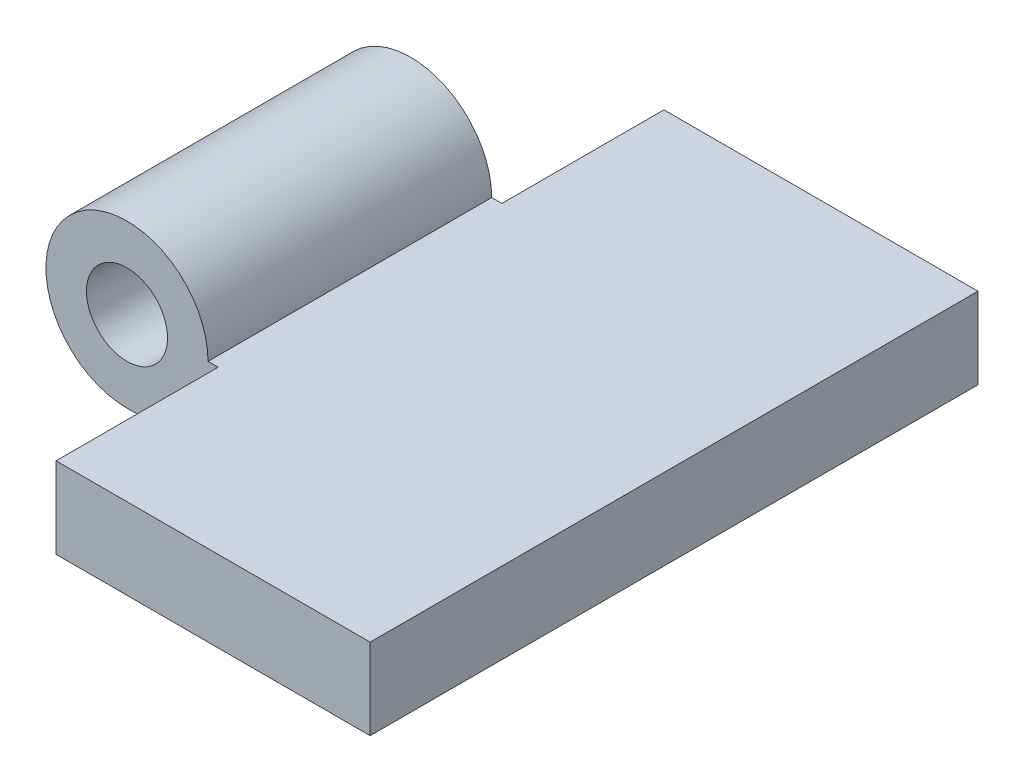
ISO-10303-21;
HEADER;
FILE_DESCRIPTION(('STEP AP214'),'2;1');
FILE_NAME('part.step','',(''),(''),'','','');
FILE_SCHEMA(('AUTOMOTIVE_DESIGN { 1 0 10303 214 1 1 1 1 }'));
ENDSEC;
DATA;
#1=APPLICATION_CONTEXT('core data for automotive mechanical design processes');
#2=APPLICATION_PROTOCOL_DEFINITION('international standard','automotive_design',2000,#1);
#3=PRODUCT_CONTEXT('',#1,'mechanical');
#4=PRODUCT('Part','Part','',(#3));
#5=PRODUCT_RELATED_PRODUCT_CATEGORY('part','',(#4));
#6=PRODUCT_DEFINITION_FORMATION('','',#4);
#7=PRODUCT_DEFINITION_CONTEXT('part definition',#1,'design');
#8=PRODUCT_DEFINITION('design','',#6,#7);
#9=PRODUCT_DEFINITION_SHAPE('','',#8);
#10=(LENGTH_UNIT() NAMED_UNIT(*) SI_UNIT(.MILLI.,.METRE.));
#11=(NAMED_UNIT(*) PLANE_ANGLE_UNIT() SI_UNIT($,.RADIAN.));
#12=(NAMED_UNIT(*) SI_UNIT($,.STERADIAN.) SOLID_ANGLE_UNIT());
#13=UNCERTAINTY_MEASURE_WITH_UNIT(LENGTH_MEASURE(1.E-05),#10,'distance_accuracy_value','');
#14=(GEOMETRIC_REPRESENTATION_CONTEXT(3) GLOBAL_UNCERTAINTY_ASSIGNED_CONTEXT((#13)) GLOBAL_UNIT_ASSIGNED_CONTEXT((#10,
#11,#12)) REPRESENTATION_CONTEXT('',''));
#15=CARTESIAN_POINT('',(0.,0.,0.));
#16=DIRECTION('',(0.,0.,1.));
#17=DIRECTION('',(1.,0.,0.));
#18=AXIS2_PLACEMENT_3D('',#15,#16,#17);
#19=CARTESIAN_POINT('',(20.,0.,30.));
#20=DIRECTION('',(-1.,0.,0.));
#21=DIRECTION('',(0.,0.,1.));
#22=AXIS2_PLACEMENT_3D('',#19,#20,#21);
#23=PLANE('',#22);
#24=DIRECTION('',(0.,1.,0.));
#25=VECTOR('',#24,1.);
#26=CARTESIAN_POINT('',(20.,0.,0.));
#27=LINE('',#26,#25);
#28=CARTESIAN_POINT('',(20.,-4.,0.));
#29=VERTEX_POINT('',#28);
#30=CARTESIAN_POINT('',(20.,0.,0.));
#31=VERTEX_POINT('',#30);
#32=EDGE_CURVE('E164',#29,#31,#27,.T.);
#33=ORIENTED_EDGE('',*,*,#32,.T.);
#34=DIRECTION('',(0.,0.,-1.));
#35=VECTOR('',#34,1.);
#36=CARTESIAN_POINT('',(20.,0.,30.));
#37=LINE('',#36,#35);
#38=CARTESIAN_POINT('',(20.,0.,30.));
#39=VERTEX_POINT('',#38);
#40=EDGE_CURVE('E196',#39,#31,#37,.T.);
#41=ORIENTED_EDGE('',*,*,#40,.F.);
#42=DIRECTION('',(0.,1.,0.));
#43=VECTOR('',#42,1.);
#44=CARTESIAN_POINT('',(20.,0.,30.));
#45=LINE('',#44,#43);
#46=CARTESIAN_POINT('',(20.,-4.,30.));
#47=VERTEX_POINT('',#46);
#48=EDGE_CURVE('E165',#47,#39,#45,.T.);
#49=ORIENTED_EDGE('',*,*,#48,.F.);
#50=DIRECTION('',(0.,0.,-1.));
#51=VECTOR('',#50,1.);
#52=CARTESIAN_POINT('',(20.,-4.,30.));
#53=LINE('',#52,#51);
#54=EDGE_CURVE('E176',#47,#29,#53,.T.);
#55=ORIENTED_EDGE('',*,*,#54,.T.);
#56=EDGE_LOOP('',(#33,#41,#49,#55));
#57=FACE_BOUND('',#56,.T.);
#58=ADVANCED_FACE('F45',(#57),#23,.F.);
#59=CARTESIAN_POINT('',(4.,0.,30.));
#60=DIRECTION('',(0.,-1.,0.));
#61=DIRECTION('',(0.,0.,-1.));
#62=AXIS2_PLACEMENT_3D('',#59,#60,#61);
#63=PLANE('',#62);
#64=DIRECTION('',(1.,0.,0.));
#65=VECTOR('',#64,1.);
#66=CARTESIAN_POINT('',(4.,0.,22.));
#67=LINE('',#66,#65);
#68=CARTESIAN_POINT('',(4.,0.,22.));
#69=VERTEX_POINT('',#68);
#70=CARTESIAN_POINT('',(4.5,0.,22.));
#71=VERTEX_POINT('',#70);
#72=EDGE_CURVE('E161',#69,#71,#67,.T.);
#73=ORIENTED_EDGE('',*,*,#72,.T.);
#74=DIRECTION('',(0.,0.,1.));
#75=VECTOR('',#74,1.);
#76=CARTESIAN_POINT('',(4.5,0.,30.));
#77=LINE('',#76,#75);
#78=CARTESIAN_POINT('',(4.5,0.,30.));
#79=VERTEX_POINT('',#78);
#80=EDGE_CURVE('E113',#71,#79,#77,.T.);
#81=ORIENTED_EDGE('',*,*,#80,.T.);
#82=DIRECTION('',(-1.,0.,0.));
#83=VECTOR('',#82,1.);
#84=CARTESIAN_POINT('',(4.,0.,30.));
#85=LINE('',#84,#83);
#86=EDGE_CURVE('E169',#39,#79,#85,.T.);
#87=ORIENTED_EDGE('',*,*,#86,.F.);
#88=ORIENTED_EDGE('',*,*,#40,.T.);
#89=DIRECTION('',(-1.,0.,0.));
#90=VECTOR('',#89,1.);
#91=CARTESIAN_POINT('',(4.,0.,0.));
#92=LINE('',#91,#90);
#93=CARTESIAN_POINT('',(4.5,0.,0.));
#94=VERTEX_POINT('',#93);
#95=EDGE_CURVE('E180',#31,#94,#92,.T.);
#96=ORIENTED_EDGE('',*,*,#95,.T.);
#97=DIRECTION('',(0.,0.,1.));
#98=VECTOR('',#97,1.);
#99=CARTESIAN_POINT('',(4.5,0.,30.));
#100=LINE('',#99,#98);
#101=CARTESIAN_POINT('',(4.5,0.,8.));
#102=VERTEX_POINT('',#101);
#103=EDGE_CURVE('E68',#94,#102,#100,.T.);
#104=ORIENTED_EDGE('',*,*,#103,.T.);
#105=DIRECTION('',(-1.,0.,0.));
#106=VECTOR('',#105,1.);
#107=CARTESIAN_POINT('',(4.,0.,8.));
#108=LINE('',#107,#106);
#109=CARTESIAN_POINT('',(4.,0.,8.));
#110=VERTEX_POINT('',#109);
#111=EDGE_CURVE('E155',#102,#110,#108,.T.);
#112=ORIENTED_EDGE('',*,*,#111,.T.);
#113=DIRECTION('',(0.,0.,-1.));
#114=VECTOR('',#113,1.);
#115=CARTESIAN_POINT('',(4.,0.,30.));
#116=LINE('',#115,#114);
#117=EDGE_CURVE('E192',#69,#110,#116,.T.);
#118=ORIENTED_EDGE('',*,*,#117,.F.);
#119=EDGE_LOOP('',(#73,#81,#87,#88,#96,#104,#112,#118));
#120=FACE_BOUND('',#119,.T.);
#121=ADVANCED_FACE('F207',(#120),#63,.F.);
#122=CARTESIAN_POINT('',(0.,0.,30.));
#123=DIRECTION('',(0.,0.,-1.));
#124=DIRECTION('',(-1.,0.,0.));
#125=AXIS2_PLACEMENT_3D('',#122,#123,#124);
#126=CYLINDRICAL_SURFACE('',#125,4.);
#127=DIRECTION('',(0.,0.,-1.));
#128=VECTOR('',#127,1.);
#129=CARTESIAN_POINT('',(0.,-4.,30.));
#130=LINE('',#129,#128);
#131=CARTESIAN_POINT('',(0.,-4.,22.));
#132=VERTEX_POINT('',#131);
#133=CARTESIAN_POINT('',(0.,-4.,8.));
#134=VERTEX_POINT('',#133);
#135=EDGE_CURVE('E189',#132,#134,#130,.T.);
#136=ORIENTED_EDGE('',*,*,#135,.F.);
#137=CARTESIAN_POINT('',(0.,0.,22.));
#138=DIRECTION('',(0.,0.,-1.));
#139=DIRECTION('',(-1.,0.,0.));
#140=AXIS2_PLACEMENT_3D('',#137,#138,#139);
#141=CIRCLE('',#140,4.);
#142=EDGE_CURVE('E122',#132,#69,#141,.T.);
#143=ORIENTED_EDGE('',*,*,#142,.T.);
#144=ORIENTED_EDGE('',*,*,#117,.T.);
#145=CARTESIAN_POINT('',(0.,0.,8.));
#146=DIRECTION('',(0.,0.,1.));
#147=DIRECTION('',(1.,0.,0.));
#148=AXIS2_PLACEMENT_3D('',#145,#146,#147);
#149=CIRCLE('',#148,4.);
#150=EDGE_CURVE('E151',#110,#134,#149,.T.);
#151=ORIENTED_EDGE('',*,*,#150,.T.);
#152=EDGE_LOOP('',(#136,#143,#144,#151));
#153=FACE_BOUND('',#152,.T.);
#154=ADVANCED_FACE('F217',(#153),#126,.T.);
#155=CARTESIAN_POINT('',(0.,-4.,30.));
#156=DIRECTION('',(0.,1.,0.));
#157=DIRECTION('',(0.,0.,1.));
#158=AXIS2_PLACEMENT_3D('',#155,#156,#157);
#159=PLANE('',#158);
#160=DIRECTION('',(1.,0.,0.));
#161=VECTOR('',#160,1.);
#162=CARTESIAN_POINT('',(0.,-4.,30.));
#163=LINE('',#162,#161);
#164=CARTESIAN_POINT('',(4.5,-4.,30.));
#165=VERTEX_POINT('',#164);
#166=EDGE_CURVE('E131',#165,#47,#163,.T.);
#167=ORIENTED_EDGE('',*,*,#166,.F.);
#168=DIRECTION('',(0.,0.,1.));
#169=VECTOR('',#168,1.);
#170=CARTESIAN_POINT('',(4.5,-4.,22.));
#171=LINE('',#170,#169);
#172=CARTESIAN_POINT('',(4.5,-4.,22.));
#173=VERTEX_POINT('',#172);
#174=EDGE_CURVE('E60',#173,#165,#171,.T.);
#175=ORIENTED_EDGE('',*,*,#174,.F.);
#176=DIRECTION('',(1.,0.,0.));
#177=VECTOR('',#176,1.);
#178=CARTESIAN_POINT('',(-4.5,-4.,22.));
#179=LINE('',#178,#177);
#180=EDGE_CURVE('E117',#132,#173,#179,.T.);
#181=ORIENTED_EDGE('',*,*,#180,.F.);
#182=ORIENTED_EDGE('',*,*,#135,.T.);
#183=DIRECTION('',(-1.,0.,0.));
#184=VECTOR('',#183,1.);
#185=CARTESIAN_POINT('',(-4.5,-4.,8.));
#186=LINE('',#185,#184);
#187=CARTESIAN_POINT('',(4.5,-4.,8.));
#188=VERTEX_POINT('',#187);
#189=EDGE_CURVE('E137',#188,#134,#186,.T.);
#190=ORIENTED_EDGE('',*,*,#189,.F.);
#191=DIRECTION('',(0.,0.,1.));
#192=VECTOR('',#191,1.);
#193=CARTESIAN_POINT('',(4.5,-4.,8.));
#194=LINE('',#193,#192);
#195=CARTESIAN_POINT('',(4.5,-4.,0.));
#196=VERTEX_POINT('',#195);
#197=EDGE_CURVE('E133',#196,#188,#194,.T.);
#198=ORIENTED_EDGE('',*,*,#197,.F.);
#199=DIRECTION('',(1.,0.,0.));
#200=VECTOR('',#199,1.);
#201=CARTESIAN_POINT('',(0.,-4.,0.));
#202=LINE('',#201,#200);
#203=EDGE_CURVE('E170',#196,#29,#202,.T.);
#204=ORIENTED_EDGE('',*,*,#203,.T.);
#205=ORIENTED_EDGE('',*,*,#54,.F.);
#206=EDGE_LOOP('',(#167,#175,#181,#182,#190,#198,#204,#205));
#207=FACE_BOUND('',#206,.T.);
#208=ADVANCED_FACE('F129',(#207),#159,.F.);
#209=CARTESIAN_POINT('',(0.,0.,30.));
#210=DIRECTION('',(0.,0.,1.));
#211=DIRECTION('',(1.,0.,0.));
#212=AXIS2_PLACEMENT_3D('',#209,#210,#211);
#213=PLANE('',#212);
#214=DIRECTION('',(0.,1.,0.));
#215=VECTOR('',#214,1.);
#216=CARTESIAN_POINT('',(4.5,0.,30.));
#217=LINE('',#216,#215);
#218=EDGE_CURVE('E11',#165,#79,#217,.T.);
#219=ORIENTED_EDGE('',*,*,#218,.F.);
#220=ORIENTED_EDGE('',*,*,#166,.T.);
#221=ORIENTED_EDGE('',*,*,#48,.T.);
#222=ORIENTED_EDGE('',*,*,#86,.T.);
#223=EDGE_LOOP('',(#219,#220,#221,#222));
#224=FACE_BOUND('',#223,.T.);
#225=ADVANCED_FACE('F224',(#224),#213,.T.);
#226=CARTESIAN_POINT('',(0.,0.,0.));
#227=DIRECTION('',(0.,0.,1.));
#228=DIRECTION('',(1.,0.,0.));
#229=AXIS2_PLACEMENT_3D('',#226,#227,#228);
#230=PLANE('',#229);
#231=ORIENTED_EDGE('',*,*,#203,.F.);
#232=DIRECTION('',(0.,1.,0.));
#233=VECTOR('',#232,1.);
#234=CARTESIAN_POINT('',(4.5,0.,0.));
#235=LINE('',#234,#233);
#236=EDGE_CURVE('E54',#196,#94,#235,.T.);
#237=ORIENTED_EDGE('',*,*,#236,.T.);
#238=ORIENTED_EDGE('',*,*,#95,.F.);
#239=ORIENTED_EDGE('',*,*,#32,.F.);
#240=EDGE_LOOP('',(#231,#237,#238,#239));
#241=FACE_BOUND('',#240,.T.);
#242=ADVANCED_FACE('F203',(#241),#230,.F.);
#243=CARTESIAN_POINT('',(-4.5,11.,8.));
#244=DIRECTION('',(0.,0.,1.));
#245=DIRECTION('',(1.,0.,0.));
#246=AXIS2_PLACEMENT_3D('',#243,#244,#245);
#247=PLANE('',#246);
#248=CARTESIAN_POINT('',(0.,0.,8.));
#249=DIRECTION('',(0.,0.,1.));
#250=DIRECTION('',(1.,0.,0.));
#251=AXIS2_PLACEMENT_3D('',#248,#249,#250);
#252=CIRCLE('',#251,2.);
#253=CARTESIAN_POINT('',(2.,0.,8.));
#254=VERTEX_POINT('',#253);
#255=EDGE_CURVE('E140',#254,#254,#252,.T.);
#256=ORIENTED_EDGE('',*,*,#255,.T.);
#257=EDGE_LOOP('',(#256));
#258=FACE_BOUND('',#257,.T.);
#259=DIRECTION('',(0.,-1.,0.));
#260=VECTOR('',#259,1.);
#261=CARTESIAN_POINT('',(4.5,11.,8.));
#262=LINE('',#261,#260);
#263=EDGE_CURVE('E142',#102,#188,#262,.T.);
#264=ORIENTED_EDGE('',*,*,#263,.T.);
#265=ORIENTED_EDGE('',*,*,#189,.T.);
#266=ORIENTED_EDGE('',*,*,#150,.F.);
#267=ORIENTED_EDGE('',*,*,#111,.F.);
#268=EDGE_LOOP('',(#264,#265,#266,#267));
#269=FACE_BOUND('',#268,.T.);
#270=ADVANCED_FACE('F214',(#258,#269),#247,.F.);
#271=CARTESIAN_POINT('',(4.5,11.,8.));
#272=DIRECTION('',(1.,0.,0.));
#273=DIRECTION('',(0.,0.,-1.));
#274=AXIS2_PLACEMENT_3D('',#271,#272,#273);
#275=PLANE('',#274);
#276=ORIENTED_EDGE('',*,*,#236,.F.);
#277=ORIENTED_EDGE('',*,*,#197,.T.);
#278=ORIENTED_EDGE('',*,*,#263,.F.);
#279=ORIENTED_EDGE('',*,*,#103,.F.);
#280=EDGE_LOOP('',(#276,#277,#278,#279));
#281=FACE_BOUND('',#280,.T.);
#282=ADVANCED_FACE('F212',(#281),#275,.F.);
#283=CARTESIAN_POINT('',(-4.5,11.,22.));
#284=DIRECTION('',(0.,0.,-1.));
#285=DIRECTION('',(-1.,0.,0.));
#286=AXIS2_PLACEMENT_3D('',#283,#284,#285);
#287=PLANE('',#286);
#288=CARTESIAN_POINT('',(0.,0.,22.));
#289=DIRECTION('',(0.,0.,-1.));
#290=DIRECTION('',(-1.,0.,0.));
#291=AXIS2_PLACEMENT_3D('',#288,#289,#290);
#292=CIRCLE('',#291,2.);
#293=CARTESIAN_POINT('',(-2.,0.,22.));
#294=VERTEX_POINT('',#293);
#295=EDGE_CURVE('E48',#294,#294,#292,.T.);
#296=ORIENTED_EDGE('',*,*,#295,.T.);
#297=EDGE_LOOP('',(#296));
#298=FACE_BOUND('',#297,.T.);
#299=ORIENTED_EDGE('',*,*,#142,.F.);
#300=ORIENTED_EDGE('',*,*,#180,.T.);
#301=DIRECTION('',(0.,-1.,0.));
#302=VECTOR('',#301,1.);
#303=CARTESIAN_POINT('',(4.5,11.,22.));
#304=LINE('',#303,#302);
#305=EDGE_CURVE('E109',#71,#173,#304,.T.);
#306=ORIENTED_EDGE('',*,*,#305,.F.);
#307=ORIENTED_EDGE('',*,*,#72,.F.);
#308=EDGE_LOOP('',(#299,#300,#306,#307));
#309=FACE_BOUND('',#308,.T.);
#310=ADVANCED_FACE('F120',(#298,#309),#287,.F.);
#311=CARTESIAN_POINT('',(4.5,11.,22.));
#312=DIRECTION('',(1.,0.,0.));
#313=DIRECTION('',(0.,0.,-1.));
#314=AXIS2_PLACEMENT_3D('',#311,#312,#313);
#315=PLANE('',#314);
#316=ORIENTED_EDGE('',*,*,#305,.T.);
#317=ORIENTED_EDGE('',*,*,#174,.T.);
#318=ORIENTED_EDGE('',*,*,#218,.T.);
#319=ORIENTED_EDGE('',*,*,#80,.F.);
#320=EDGE_LOOP('',(#316,#317,#318,#319));
#321=FACE_BOUND('',#320,.T.);
#322=ADVANCED_FACE('F111',(#321),#315,.F.);
#323=CARTESIAN_POINT('',(0.,0.,32.));
#324=DIRECTION('',(0.,0.,-1.));
#325=DIRECTION('',(-1.,0.,0.));
#326=AXIS2_PLACEMENT_3D('',#323,#324,#325);
#327=CYLINDRICAL_SURFACE('',#326,2.);
#328=ORIENTED_EDGE('',*,*,#295,.F.);
#329=EDGE_LOOP('',(#328));
#330=FACE_BOUND('',#329,.T.);
#331=ORIENTED_EDGE('',*,*,#255,.F.);
#332=EDGE_LOOP('',(#331));
#333=FACE_BOUND('',#332,.T.);
#334=ADVANCED_FACE('F298',(#330,#333),#327,.F.);
#335=CLOSED_SHELL('',(#58,#121,#154,#208,#225,#242,#270,#282,#310,#322,#334));
#336=MANIFOLD_SOLID_BREP('B2',#335);
#337=ADVANCED_BREP_SHAPE_REPRESENTATION('',(#18,#336),#14);
#338=SHAPE_DEFINITION_REPRESENTATION(#9,#337);
ENDSEC;
END-ISO-10303-21;
